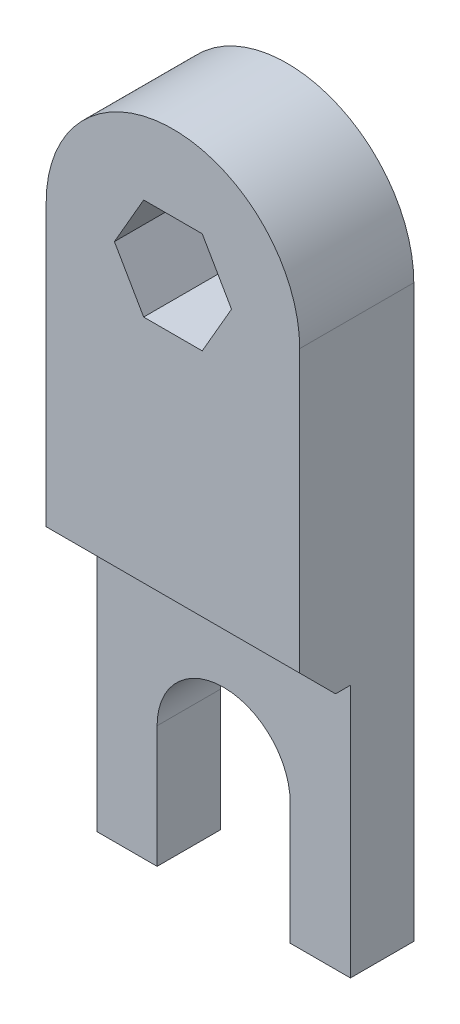
ISO-10303-21;
HEADER;
FILE_DESCRIPTION(('STEP AP214'),'2;1');
FILE_NAME('part.step','',(''),(''),'','','');
FILE_SCHEMA(('AUTOMOTIVE_DESIGN { 1 0 10303 214 1 1 1 1 }'));
ENDSEC;
DATA;
#1=APPLICATION_CONTEXT('core data for automotive mechanical design processes');
#2=APPLICATION_PROTOCOL_DEFINITION('international standard','automotive_design',2000,#1);
#3=PRODUCT_CONTEXT('',#1,'mechanical');
#4=PRODUCT('Part','Part','',(#3));
#5=PRODUCT_RELATED_PRODUCT_CATEGORY('part','',(#4));
#6=PRODUCT_DEFINITION_FORMATION('','',#4);
#7=PRODUCT_DEFINITION_CONTEXT('part definition',#1,'design');
#8=PRODUCT_DEFINITION('design','',#6,#7);
#9=PRODUCT_DEFINITION_SHAPE('','',#8);
#10=(LENGTH_UNIT() NAMED_UNIT(*) SI_UNIT(.MILLI.,.METRE.));
#11=(NAMED_UNIT(*) PLANE_ANGLE_UNIT() SI_UNIT($,.RADIAN.));
#12=(NAMED_UNIT(*) SI_UNIT($,.STERADIAN.) SOLID_ANGLE_UNIT());
#13=UNCERTAINTY_MEASURE_WITH_UNIT(LENGTH_MEASURE(1.E-05),#10,'distance_accuracy_value','');
#14=(GEOMETRIC_REPRESENTATION_CONTEXT(3) GLOBAL_UNCERTAINTY_ASSIGNED_CONTEXT((#13)) GLOBAL_UNIT_ASSIGNED_CONTEXT((#10,
#11,#12)) REPRESENTATION_CONTEXT('',''));
#15=CARTESIAN_POINT('',(0.,0.,0.));
#16=DIRECTION('',(0.,0.,1.));
#17=DIRECTION('',(1.,0.,0.));
#18=AXIS2_PLACEMENT_3D('',#15,#16,#17);
#19=CARTESIAN_POINT('',(4.,4.000000018127,3.6));
#20=DIRECTION('',(0.,-1.,0.));
#21=DIRECTION('',(0.,0.,-1.));
#22=AXIS2_PLACEMENT_3D('',#19,#20,#21);
#23=PLANE('',#22);
#24=DIRECTION('',(0.,0.,-1.));
#25=VECTOR('',#24,1.);
#26=CARTESIAN_POINT('',(-4.00000000000001,4.000000018127,3.6));
#27=LINE('',#26,#25);
#28=CARTESIAN_POINT('',(-4.00000000000001,4.000000018127,2.4686289387967));
#29=VERTEX_POINT('',#28);
#30=CARTESIAN_POINT('',(-3.99999999999984,4.000000018127,2.));
#31=VERTEX_POINT('',#30);
#32=EDGE_CURVE('E295',#29,#31,#27,.T.);
#33=ORIENTED_EDGE('',*,*,#32,.T.);
#34=DIRECTION('',(1.,0.,0.));
#35=VECTOR('',#34,1.);
#36=CARTESIAN_POINT('',(-3.99999999999984,4.000000018127,2.));
#37=LINE('',#36,#35);
#38=CARTESIAN_POINT('',(4.,4.000000018127,2.));
#39=VERTEX_POINT('',#38);
#40=EDGE_CURVE('E169',#31,#39,#37,.T.);
#41=ORIENTED_EDGE('',*,*,#40,.T.);
#42=DIRECTION('',(0.,0.,-1.));
#43=VECTOR('',#42,1.);
#44=CARTESIAN_POINT('',(4.,4.000000018127,3.6));
#45=LINE('',#44,#43);
#46=CARTESIAN_POINT('',(4.,4.000000018127,2.4686289387967));
#47=VERTEX_POINT('',#46);
#48=EDGE_CURVE('E180',#47,#39,#45,.T.);
#49=ORIENTED_EDGE('',*,*,#48,.F.);
#50=DIRECTION('',(-1.,0.,0.));
#51=VECTOR('',#50,1.);
#52=CARTESIAN_POINT('',(-4.00000000000001,4.000000018127,2.4686289387967));
#53=LINE('',#52,#51);
#54=EDGE_CURVE('E294',#47,#29,#53,.T.);
#55=ORIENTED_EDGE('',*,*,#54,.T.);
#56=EDGE_LOOP('',(#33,#41,#49,#55));
#57=FACE_BOUND('',#56,.T.);
#58=ADVANCED_FACE('F37',(#57),#23,.T.);
#59=CARTESIAN_POINT('',(0.,14.,3.6));
#60=DIRECTION('',(0.,0.,-1.));
#61=DIRECTION('',(-1.,0.,0.));
#62=AXIS2_PLACEMENT_3D('',#59,#60,#61);
#63=CYLINDRICAL_SURFACE('',#62,4.00000000000001);
#64=CARTESIAN_POINT('',(0.,14.,0.));
#65=DIRECTION('',(0.,0.,-1.));
#66=DIRECTION('',(-1.,0.,0.));
#67=AXIS2_PLACEMENT_3D('',#64,#65,#66);
#68=CIRCLE('',#67,4.00000000000001);
#69=CARTESIAN_POINT('',(-4.00000000000002,14.,0.));
#70=VERTEX_POINT('',#69);
#71=CARTESIAN_POINT('',(4.,14.0000000000001,0.));
#72=VERTEX_POINT('',#71);
#73=EDGE_CURVE('E264',#70,#72,#68,.T.);
#74=ORIENTED_EDGE('',*,*,#73,.F.);
#75=DIRECTION('',(0.,0.,-1.));
#76=VECTOR('',#75,1.);
#77=CARTESIAN_POINT('',(-4.00000000000002,14.,3.6));
#78=LINE('',#77,#76);
#79=CARTESIAN_POINT('',(-4.00000000000002,14.,3.6));
#80=VERTEX_POINT('',#79);
#81=EDGE_CURVE('E292',#80,#70,#78,.T.);
#82=ORIENTED_EDGE('',*,*,#81,.F.);
#83=CARTESIAN_POINT('',(0.,14.,3.6));
#84=DIRECTION('',(0.,0.,-1.));
#85=DIRECTION('',(-1.,0.,0.));
#86=AXIS2_PLACEMENT_3D('',#83,#84,#85);
#87=CIRCLE('',#86,4.00000000000001);
#88=CARTESIAN_POINT('',(4.,14.0000000000001,3.6));
#89=VERTEX_POINT('',#88);
#90=EDGE_CURVE('E275',#80,#89,#87,.T.);
#91=ORIENTED_EDGE('',*,*,#90,.T.);
#92=DIRECTION('',(0.,0.,-1.));
#93=VECTOR('',#92,1.);
#94=CARTESIAN_POINT('',(4.,14.0000000000001,3.6));
#95=LINE('',#94,#93);
#96=EDGE_CURVE('E284',#89,#72,#95,.T.);
#97=ORIENTED_EDGE('',*,*,#96,.T.);
#98=EDGE_LOOP('',(#74,#82,#91,#97));
#99=FACE_BOUND('',#98,.T.);
#100=ADVANCED_FACE('F309',(#99),#63,.T.);
#101=CARTESIAN_POINT('',(-4.00000000000001,4.000000018127,3.6));
#102=DIRECTION('',(-1.,0.,0.));
#103=DIRECTION('',(0.,-1.,0.));
#104=AXIS2_PLACEMENT_3D('',#101,#102,#103);
#105=PLANE('',#104);
#106=ORIENTED_EDGE('',*,*,#32,.F.);
#107=DIRECTION('',(0.,0.707106690551039,0.707106871822044));
#108=VECTOR('',#107,1.);
#109=CARTESIAN_POINT('',(-4.00000000000001,4.56568554872863,3.03431461441518));
#110=LINE('',#109,#108);
#111=CARTESIAN_POINT('',(-4.00000000000001,5.13137078929667,3.6));
#112=VERTEX_POINT('',#111);
#113=EDGE_CURVE('E304',#29,#112,#110,.T.);
#114=ORIENTED_EDGE('',*,*,#113,.T.);
#115=DIRECTION('',(0.,1.,0.));
#116=VECTOR('',#115,1.);
#117=CARTESIAN_POINT('',(-4.00000000000001,4.000000018127,3.6));
#118=LINE('',#117,#116);
#119=EDGE_CURVE('E282',#112,#80,#118,.T.);
#120=ORIENTED_EDGE('',*,*,#119,.T.);
#121=ORIENTED_EDGE('',*,*,#81,.T.);
#122=DIRECTION('',(0.,1.,0.));
#123=VECTOR('',#122,1.);
#124=CARTESIAN_POINT('',(-4.00000000000001,4.000000018127,0.));
#125=LINE('',#124,#123);
#126=CARTESIAN_POINT('',(-3.99999999999984,-4.,0.));
#127=VERTEX_POINT('',#126);
#128=EDGE_CURVE('E279',#127,#70,#125,.T.);
#129=ORIENTED_EDGE('',*,*,#128,.F.);
#130=DIRECTION('',(0.,0.,-1.));
#131=VECTOR('',#130,1.);
#132=CARTESIAN_POINT('',(-3.99999999999984,-4.,2.));
#133=LINE('',#132,#131);
#134=CARTESIAN_POINT('',(-3.99999999999984,-4.,2.));
#135=VERTEX_POINT('',#134);
#136=EDGE_CURVE('E217',#135,#127,#133,.T.);
#137=ORIENTED_EDGE('',*,*,#136,.F.);
#138=DIRECTION('',(0.,1.,0.));
#139=VECTOR('',#138,1.);
#140=CARTESIAN_POINT('',(-3.99999999999984,-4.,2.));
#141=LINE('',#140,#139);
#142=EDGE_CURVE('E191',#135,#31,#141,.T.);
#143=ORIENTED_EDGE('',*,*,#142,.T.);
#144=EDGE_LOOP('',(#106,#114,#120,#121,#129,#137,#143));
#145=FACE_BOUND('',#144,.T.);
#146=ADVANCED_FACE('F315',(#145),#105,.T.);
#147=CARTESIAN_POINT('',(4.,14.0000000000001,3.6));
#148=DIRECTION('',(1.,0.,0.));
#149=DIRECTION('',(0.,1.,0.));
#150=AXIS2_PLACEMENT_3D('',#147,#148,#149);
#151=PLANE('',#150);
#152=DIRECTION('',(0.,-1.,0.));
#153=VECTOR('',#152,1.);
#154=CARTESIAN_POINT('',(4.,14.0000000000001,3.6));
#155=LINE('',#154,#153);
#156=CARTESIAN_POINT('',(4.,5.13137078929668,3.6));
#157=VERTEX_POINT('',#156);
#158=EDGE_CURVE('E278',#89,#157,#155,.T.);
#159=ORIENTED_EDGE('',*,*,#158,.T.);
#160=DIRECTION('',(0.,-0.707106690551039,-0.707106871822044));
#161=VECTOR('',#160,1.);
#162=CARTESIAN_POINT('',(4.,9.56568425788561,8.03431460535156));
#163=LINE('',#162,#161);
#164=EDGE_CURVE('E11',#157,#47,#163,.T.);
#165=ORIENTED_EDGE('',*,*,#164,.T.);
#166=ORIENTED_EDGE('',*,*,#48,.T.);
#167=DIRECTION('',(0.,-1.,0.));
#168=VECTOR('',#167,1.);
#169=CARTESIAN_POINT('',(4.,4.000000018127,2.));
#170=LINE('',#169,#168);
#171=CARTESIAN_POINT('',(4.,-4.,2.));
#172=VERTEX_POINT('',#171);
#173=EDGE_CURVE('E54',#39,#172,#170,.T.);
#174=ORIENTED_EDGE('',*,*,#173,.T.);
#175=DIRECTION('',(0.,0.,-1.));
#176=VECTOR('',#175,1.);
#177=CARTESIAN_POINT('',(4.,-4.,2.));
#178=LINE('',#177,#176);
#179=CARTESIAN_POINT('',(4.,-4.,0.));
#180=VERTEX_POINT('',#179);
#181=EDGE_CURVE('E161',#172,#180,#178,.T.);
#182=ORIENTED_EDGE('',*,*,#181,.T.);
#183=DIRECTION('',(0.,-1.,0.));
#184=VECTOR('',#183,1.);
#185=CARTESIAN_POINT('',(4.,14.0000000000001,0.));
#186=LINE('',#185,#184);
#187=EDGE_CURVE('E287',#72,#180,#186,.T.);
#188=ORIENTED_EDGE('',*,*,#187,.F.);
#189=ORIENTED_EDGE('',*,*,#96,.F.);
#190=EDGE_LOOP('',(#159,#165,#166,#174,#182,#188,#189));
#191=FACE_BOUND('',#190,.T.);
#192=ADVANCED_FACE('F178',(#191),#151,.T.);
#193=CARTESIAN_POINT('',(0.,14.,3.6));
#194=DIRECTION('',(0.,0.,-1.));
#195=DIRECTION('',(-1.,0.,0.));
#196=AXIS2_PLACEMENT_3D('',#193,#194,#195);
#197=PLANE('',#196);
#198=DIRECTION('',(-0.500000000000075,-0.866025403784395,0.));
#199=VECTOR('',#198,1.);
#200=CARTESIAN_POINT('',(0.92376,12.400000746,3.6));
#201=LINE('',#200,#199);
#202=CARTESIAN_POINT('',(1.84752000000021,13.9999999999999,3.6));
#203=VERTEX_POINT('',#202);
#204=CARTESIAN_POINT('',(0.92376,12.400000746,3.6));
#205=VERTEX_POINT('',#204);
#206=EDGE_CURVE('E243',#203,#205,#201,.T.);
#207=ORIENTED_EDGE('',*,*,#206,.T.);
#208=DIRECTION('',(-1.,0.,0.));
#209=VECTOR('',#208,1.);
#210=CARTESIAN_POINT('',(-0.923759999999616,12.4000007459999,3.6));
#211=LINE('',#210,#209);
#212=CARTESIAN_POINT('',(-0.923759999999616,12.4000007459999,3.6));
#213=VERTEX_POINT('',#212);
#214=EDGE_CURVE('E227',#205,#213,#211,.T.);
#215=ORIENTED_EDGE('',*,*,#214,.T.);
#216=DIRECTION('',(-0.500000000000015,0.86602540378443,0.));
#217=VECTOR('',#216,1.);
#218=CARTESIAN_POINT('',(-1.84751999999983,14.0000000000001,3.6));
#219=LINE('',#218,#217);
#220=CARTESIAN_POINT('',(-1.84751999999983,14.0000000000001,3.6));
#221=VERTEX_POINT('',#220);
#222=EDGE_CURVE('E230',#213,#221,#219,.T.);
#223=ORIENTED_EDGE('',*,*,#222,.T.);
#224=DIRECTION('',(0.5,0.866025403784439,0.));
#225=VECTOR('',#224,1.);
#226=CARTESIAN_POINT('',(-0.923759999999756,15.599999254,3.6));
#227=LINE('',#226,#225);
#228=CARTESIAN_POINT('',(-0.923759999999756,15.599999254,3.6));
#229=VERTEX_POINT('',#228);
#230=EDGE_CURVE('E234',#221,#229,#227,.T.);
#231=ORIENTED_EDGE('',*,*,#230,.T.);
#232=DIRECTION('',(1.,0.,0.));
#233=VECTOR('',#232,1.);
#234=CARTESIAN_POINT('',(0.923760000000031,15.599999254,3.6));
#235=LINE('',#234,#233);
#236=CARTESIAN_POINT('',(0.923760000000031,15.599999254,3.6));
#237=VERTEX_POINT('',#236);
#238=EDGE_CURVE('E237',#229,#237,#235,.T.);
#239=ORIENTED_EDGE('',*,*,#238,.T.);
#240=DIRECTION('',(0.5,-0.866025403784439,0.));
#241=VECTOR('',#240,1.);
#242=CARTESIAN_POINT('',(1.84752000000021,13.9999999999999,3.6));
#243=LINE('',#242,#241);
#244=EDGE_CURVE('E240',#237,#203,#243,.T.);
#245=ORIENTED_EDGE('',*,*,#244,.T.);
#246=EDGE_LOOP('',(#207,#215,#223,#231,#239,#245));
#247=FACE_BOUND('',#246,.T.);
#248=ORIENTED_EDGE('',*,*,#119,.F.);
#249=DIRECTION('',(1.,0.,0.));
#250=VECTOR('',#249,1.);
#251=CARTESIAN_POINT('',(4.,5.13137078929667,3.6));
#252=LINE('',#251,#250);
#253=EDGE_CURVE('E46',#112,#157,#252,.T.);
#254=ORIENTED_EDGE('',*,*,#253,.T.);
#255=ORIENTED_EDGE('',*,*,#158,.F.);
#256=ORIENTED_EDGE('',*,*,#90,.F.);
#257=EDGE_LOOP('',(#248,#254,#255,#256));
#258=FACE_BOUND('',#257,.T.);
#259=ADVANCED_FACE('F347',(#247,#258),#197,.F.);
#260=CARTESIAN_POINT('',(0.,14.,0.));
#261=DIRECTION('',(0.,0.,-1.));
#262=DIRECTION('',(-1.,0.,0.));
#263=AXIS2_PLACEMENT_3D('',#260,#261,#262);
#264=PLANE('',#263);
#265=DIRECTION('',(-1.,0.,0.));
#266=VECTOR('',#265,1.);
#267=CARTESIAN_POINT('',(-0.923759999999616,12.4000007459999,0.));
#268=LINE('',#267,#266);
#269=CARTESIAN_POINT('',(0.92376,12.400000746,0.));
#270=VERTEX_POINT('',#269);
#271=CARTESIAN_POINT('',(-0.923759999999616,12.4000007459999,0.));
#272=VERTEX_POINT('',#271);
#273=EDGE_CURVE('E219',#270,#272,#268,.T.);
#274=ORIENTED_EDGE('',*,*,#273,.F.);
#275=DIRECTION('',(-0.500000000000075,-0.866025403784395,0.));
#276=VECTOR('',#275,1.);
#277=CARTESIAN_POINT('',(0.92376,12.400000746,0.));
#278=LINE('',#277,#276);
#279=CARTESIAN_POINT('',(1.84752000000021,13.9999999999999,0.));
#280=VERTEX_POINT('',#279);
#281=EDGE_CURVE('E231',#280,#270,#278,.T.);
#282=ORIENTED_EDGE('',*,*,#281,.F.);
#283=DIRECTION('',(0.5,-0.866025403784439,0.));
#284=VECTOR('',#283,1.);
#285=CARTESIAN_POINT('',(1.84752000000021,13.9999999999999,0.));
#286=LINE('',#285,#284);
#287=CARTESIAN_POINT('',(0.923760000000031,15.599999254,0.));
#288=VERTEX_POINT('',#287);
#289=EDGE_CURVE('E257',#288,#280,#286,.T.);
#290=ORIENTED_EDGE('',*,*,#289,.F.);
#291=DIRECTION('',(1.,0.,0.));
#292=VECTOR('',#291,1.);
#293=CARTESIAN_POINT('',(0.923760000000031,15.599999254,0.));
#294=LINE('',#293,#292);
#295=CARTESIAN_POINT('',(-0.923759999999756,15.599999254,0.));
#296=VERTEX_POINT('',#295);
#297=EDGE_CURVE('E254',#296,#288,#294,.T.);
#298=ORIENTED_EDGE('',*,*,#297,.F.);
#299=DIRECTION('',(0.5,0.866025403784439,0.));
#300=VECTOR('',#299,1.);
#301=CARTESIAN_POINT('',(-0.923759999999756,15.599999254,0.));
#302=LINE('',#301,#300);
#303=CARTESIAN_POINT('',(-1.84751999999983,14.0000000000001,0.));
#304=VERTEX_POINT('',#303);
#305=EDGE_CURVE('E251',#304,#296,#302,.T.);
#306=ORIENTED_EDGE('',*,*,#305,.F.);
#307=DIRECTION('',(-0.500000000000015,0.86602540378443,0.));
#308=VECTOR('',#307,1.);
#309=CARTESIAN_POINT('',(-1.84751999999983,14.0000000000001,0.));
#310=LINE('',#309,#308);
#311=EDGE_CURVE('E248',#272,#304,#310,.T.);
#312=ORIENTED_EDGE('',*,*,#311,.F.);
#313=EDGE_LOOP('',(#274,#282,#290,#298,#306,#312));
#314=FACE_BOUND('',#313,.T.);
#315=ORIENTED_EDGE('',*,*,#73,.T.);
#316=ORIENTED_EDGE('',*,*,#187,.T.);
#317=DIRECTION('',(-1.,0.,0.));
#318=VECTOR('',#317,1.);
#319=CARTESIAN_POINT('',(4.,-4.,0.));
#320=LINE('',#319,#318);
#321=CARTESIAN_POINT('',(2.1,-4.,0.));
#322=VERTEX_POINT('',#321);
#323=EDGE_CURVE('E165',#180,#322,#320,.T.);
#324=ORIENTED_EDGE('',*,*,#323,.T.);
#325=DIRECTION('',(0.,1.,0.));
#326=VECTOR('',#325,1.);
#327=CARTESIAN_POINT('',(2.1,-4.,0.));
#328=LINE('',#327,#326);
#329=CARTESIAN_POINT('',(2.09999999999993,-0.156392754570969,0.));
#330=VERTEX_POINT('',#329);
#331=EDGE_CURVE('E209',#322,#330,#328,.T.);
#332=ORIENTED_EDGE('',*,*,#331,.T.);
#333=CARTESIAN_POINT('',(0.,-0.156392754570966,0.));
#334=DIRECTION('',(0.,0.,1.));
#335=DIRECTION('',(-1.,0.,0.));
#336=AXIS2_PLACEMENT_3D('',#333,#334,#335);
#337=CIRCLE('',#336,2.09999999999992);
#338=CARTESIAN_POINT('',(-2.09999999999992,-0.156392754570964,0.));
#339=VERTEX_POINT('',#338);
#340=EDGE_CURVE('E212',#330,#339,#337,.T.);
#341=ORIENTED_EDGE('',*,*,#340,.T.);
#342=DIRECTION('',(0.,-1.,0.));
#343=VECTOR('',#342,1.);
#344=CARTESIAN_POINT('',(-2.09999999999992,-0.156392754570964,0.));
#345=LINE('',#344,#343);
#346=CARTESIAN_POINT('',(-2.09999999999984,-4.,0.));
#347=VERTEX_POINT('',#346);
#348=EDGE_CURVE('E184',#339,#347,#345,.T.);
#349=ORIENTED_EDGE('',*,*,#348,.T.);
#350=DIRECTION('',(-1.,0.,0.));
#351=VECTOR('',#350,1.);
#352=CARTESIAN_POINT('',(-2.09999999999984,-4.,0.));
#353=LINE('',#352,#351);
#354=EDGE_CURVE('E181',#347,#127,#353,.T.);
#355=ORIENTED_EDGE('',*,*,#354,.T.);
#356=ORIENTED_EDGE('',*,*,#128,.T.);
#357=EDGE_LOOP('',(#315,#316,#324,#332,#341,#349,#355,#356));
#358=FACE_BOUND('',#357,.T.);
#359=ADVANCED_FACE('F313',(#314,#358),#264,.T.);
#360=CARTESIAN_POINT('',(-0.923759999999616,12.4000007459999,3.6));
#361=DIRECTION('',(0.,-1.,0.));
#362=DIRECTION('',(1.,0.,0.));
#363=AXIS2_PLACEMENT_3D('',#360,#361,#362);
#364=PLANE('',#363);
#365=ORIENTED_EDGE('',*,*,#273,.T.);
#366=DIRECTION('',(0.,0.,-1.));
#367=VECTOR('',#366,1.);
#368=CARTESIAN_POINT('',(-0.923759999999616,12.4000007459999,3.6));
#369=LINE('',#368,#367);
#370=EDGE_CURVE('E246',#213,#272,#369,.T.);
#371=ORIENTED_EDGE('',*,*,#370,.F.);
#372=ORIENTED_EDGE('',*,*,#214,.F.);
#373=DIRECTION('',(0.,0.,-1.));
#374=VECTOR('',#373,1.);
#375=CARTESIAN_POINT('',(0.92376,12.400000746,3.6));
#376=LINE('',#375,#374);
#377=EDGE_CURVE('E262',#205,#270,#376,.T.);
#378=ORIENTED_EDGE('',*,*,#377,.T.);
#379=EDGE_LOOP('',(#365,#371,#372,#378));
#380=FACE_BOUND('',#379,.T.);
#381=ADVANCED_FACE('F366',(#380),#364,.F.);
#382=CARTESIAN_POINT('',(0.92376,12.400000746,3.6));
#383=DIRECTION('',(0.866025403784395,-0.500000000000075,0.));
#384=DIRECTION('',(0.500000000000075,0.866025403784395,0.));
#385=AXIS2_PLACEMENT_3D('',#382,#383,#384);
#386=PLANE('',#385);
#387=ORIENTED_EDGE('',*,*,#281,.T.);
#388=ORIENTED_EDGE('',*,*,#377,.F.);
#389=ORIENTED_EDGE('',*,*,#206,.F.);
#390=DIRECTION('',(0.,0.,-1.));
#391=VECTOR('',#390,1.);
#392=CARTESIAN_POINT('',(1.84752000000021,13.9999999999999,3.6));
#393=LINE('',#392,#391);
#394=EDGE_CURVE('E265',#203,#280,#393,.T.);
#395=ORIENTED_EDGE('',*,*,#394,.T.);
#396=EDGE_LOOP('',(#387,#388,#389,#395));
#397=FACE_BOUND('',#396,.T.);
#398=ADVANCED_FACE('F371',(#397),#386,.F.);
#399=CARTESIAN_POINT('',(1.84752000000021,13.9999999999999,3.6));
#400=DIRECTION('',(0.866025403784438,0.5,0.));
#401=DIRECTION('',(-0.5,0.866025403784439,0.));
#402=AXIS2_PLACEMENT_3D('',#399,#400,#401);
#403=PLANE('',#402);
#404=ORIENTED_EDGE('',*,*,#289,.T.);
#405=ORIENTED_EDGE('',*,*,#394,.F.);
#406=ORIENTED_EDGE('',*,*,#244,.F.);
#407=DIRECTION('',(0.,0.,-1.));
#408=VECTOR('',#407,1.);
#409=CARTESIAN_POINT('',(0.923760000000031,15.599999254,3.6));
#410=LINE('',#409,#408);
#411=EDGE_CURVE('E267',#237,#288,#410,.T.);
#412=ORIENTED_EDGE('',*,*,#411,.T.);
#413=EDGE_LOOP('',(#404,#405,#406,#412));
#414=FACE_BOUND('',#413,.T.);
#415=ADVANCED_FACE('F383',(#414),#403,.F.);
#416=CARTESIAN_POINT('',(0.923760000000031,15.599999254,3.6));
#417=DIRECTION('',(0.,1.,0.));
#418=DIRECTION('',(0.,0.,1.));
#419=AXIS2_PLACEMENT_3D('',#416,#417,#418);
#420=PLANE('',#419);
#421=ORIENTED_EDGE('',*,*,#297,.T.);
#422=ORIENTED_EDGE('',*,*,#411,.F.);
#423=ORIENTED_EDGE('',*,*,#238,.F.);
#424=DIRECTION('',(0.,0.,-1.));
#425=VECTOR('',#424,1.);
#426=CARTESIAN_POINT('',(-0.923759999999756,15.599999254,3.6));
#427=LINE('',#426,#425);
#428=EDGE_CURVE('E269',#229,#296,#427,.T.);
#429=ORIENTED_EDGE('',*,*,#428,.T.);
#430=EDGE_LOOP('',(#421,#422,#423,#429));
#431=FACE_BOUND('',#430,.T.);
#432=ADVANCED_FACE('F393',(#431),#420,.F.);
#433=CARTESIAN_POINT('',(-0.923759999999756,15.599999254,3.6));
#434=DIRECTION('',(-0.866025403784439,0.5,0.));
#435=DIRECTION('',(-0.5,-0.866025403784439,0.));
#436=AXIS2_PLACEMENT_3D('',#433,#434,#435);
#437=PLANE('',#436);
#438=ORIENTED_EDGE('',*,*,#305,.T.);
#439=ORIENTED_EDGE('',*,*,#428,.F.);
#440=ORIENTED_EDGE('',*,*,#230,.F.);
#441=DIRECTION('',(0.,0.,-1.));
#442=VECTOR('',#441,1.);
#443=CARTESIAN_POINT('',(-1.84751999999983,14.0000000000001,3.6));
#444=LINE('',#443,#442);
#445=EDGE_CURVE('E271',#221,#304,#444,.T.);
#446=ORIENTED_EDGE('',*,*,#445,.T.);
#447=EDGE_LOOP('',(#438,#439,#440,#446));
#448=FACE_BOUND('',#447,.T.);
#449=ADVANCED_FACE('F403',(#448),#437,.F.);
#450=CARTESIAN_POINT('',(-1.84751999999983,14.0000000000001,3.6));
#451=DIRECTION('',(-0.86602540378443,-0.500000000000015,0.));
#452=DIRECTION('',(0.500000000000015,-0.86602540378443,0.));
#453=AXIS2_PLACEMENT_3D('',#450,#451,#452);
#454=PLANE('',#453);
#455=ORIENTED_EDGE('',*,*,#311,.T.);
#456=ORIENTED_EDGE('',*,*,#445,.F.);
#457=ORIENTED_EDGE('',*,*,#222,.F.);
#458=ORIENTED_EDGE('',*,*,#370,.T.);
#459=EDGE_LOOP('',(#455,#456,#457,#458));
#460=FACE_BOUND('',#459,.T.);
#461=ADVANCED_FACE('F413',(#460),#454,.F.);
#462=CARTESIAN_POINT('',(4.,4.000000018127,2.4686289387967));
#463=DIRECTION('',(0.,-0.707106871822044,0.707106690551039));
#464=DIRECTION('',(1.,0.,0.));
#465=AXIS2_PLACEMENT_3D('',#462,#463,#464);
#466=PLANE('',#465);
#467=ORIENTED_EDGE('',*,*,#164,.F.);
#468=ORIENTED_EDGE('',*,*,#253,.F.);
#469=ORIENTED_EDGE('',*,*,#113,.F.);
#470=ORIENTED_EDGE('',*,*,#54,.F.);
#471=EDGE_LOOP('',(#467,#468,#469,#470));
#472=FACE_BOUND('',#471,.T.);
#473=ADVANCED_FACE('F39',(#472),#466,.T.);
#474=CARTESIAN_POINT('',(-2.09999999999984,-4.,2.));
#475=DIRECTION('',(0.,-1.,0.));
#476=DIRECTION('',(0.,0.,-1.));
#477=AXIS2_PLACEMENT_3D('',#474,#475,#476);
#478=PLANE('',#477);
#479=ORIENTED_EDGE('',*,*,#354,.F.);
#480=DIRECTION('',(0.,0.,-1.));
#481=VECTOR('',#480,1.);
#482=CARTESIAN_POINT('',(-2.09999999999984,-4.,2.));
#483=LINE('',#482,#481);
#484=CARTESIAN_POINT('',(-2.09999999999984,-4.,2.));
#485=VERTEX_POINT('',#484);
#486=EDGE_CURVE('E220',#485,#347,#483,.T.);
#487=ORIENTED_EDGE('',*,*,#486,.F.);
#488=DIRECTION('',(-1.,0.,0.));
#489=VECTOR('',#488,1.);
#490=CARTESIAN_POINT('',(-2.09999999999984,-4.,2.));
#491=LINE('',#490,#489);
#492=EDGE_CURVE('E192',#485,#135,#491,.T.);
#493=ORIENTED_EDGE('',*,*,#492,.T.);
#494=ORIENTED_EDGE('',*,*,#136,.T.);
#495=EDGE_LOOP('',(#479,#487,#493,#494));
#496=FACE_BOUND('',#495,.T.);
#497=ADVANCED_FACE('F316',(#496),#478,.T.);
#498=CARTESIAN_POINT('',(-2.09999999999992,-0.156392754570964,2.));
#499=DIRECTION('',(1.,0.,0.));
#500=DIRECTION('',(0.,1.,0.));
#501=AXIS2_PLACEMENT_3D('',#498,#499,#500);
#502=PLANE('',#501);
#503=ORIENTED_EDGE('',*,*,#348,.F.);
#504=DIRECTION('',(0.,0.,-1.));
#505=VECTOR('',#504,1.);
#506=CARTESIAN_POINT('',(-2.09999999999992,-0.156392754570964,2.));
#507=LINE('',#506,#505);
#508=CARTESIAN_POINT('',(-2.09999999999992,-0.156392754570964,2.));
#509=VERTEX_POINT('',#508);
#510=EDGE_CURVE('E222',#509,#339,#507,.T.);
#511=ORIENTED_EDGE('',*,*,#510,.F.);
#512=DIRECTION('',(0.,-1.,0.));
#513=VECTOR('',#512,1.);
#514=CARTESIAN_POINT('',(-2.09999999999992,-0.156392754570964,2.));
#515=LINE('',#514,#513);
#516=EDGE_CURVE('E197',#509,#485,#515,.T.);
#517=ORIENTED_EDGE('',*,*,#516,.T.);
#518=ORIENTED_EDGE('',*,*,#486,.T.);
#519=EDGE_LOOP('',(#503,#511,#517,#518));
#520=FACE_BOUND('',#519,.T.);
#521=ADVANCED_FACE('F320',(#520),#502,.T.);
#522=CARTESIAN_POINT('',(0.,-0.156392754570966,2.));
#523=DIRECTION('',(0.,0.,-1.));
#524=DIRECTION('',(-1.,0.,0.));
#525=AXIS2_PLACEMENT_3D('',#522,#523,#524);
#526=CYLINDRICAL_SURFACE('',#525,2.09999999999992);
#527=ORIENTED_EDGE('',*,*,#340,.F.);
#528=DIRECTION('',(0.,0.,-1.));
#529=VECTOR('',#528,1.);
#530=CARTESIAN_POINT('',(2.09999999999993,-0.156392754570969,2.));
#531=LINE('',#530,#529);
#532=CARTESIAN_POINT('',(2.09999999999993,-0.156392754570969,2.));
#533=VERTEX_POINT('',#532);
#534=EDGE_CURVE('E224',#533,#330,#531,.T.);
#535=ORIENTED_EDGE('',*,*,#534,.F.);
#536=CARTESIAN_POINT('',(0.,-0.156392754570966,2.));
#537=DIRECTION('',(0.,0.,1.));
#538=DIRECTION('',(-1.,0.,0.));
#539=AXIS2_PLACEMENT_3D('',#536,#537,#538);
#540=CIRCLE('',#539,2.09999999999992);
#541=EDGE_CURVE('E203',#533,#509,#540,.T.);
#542=ORIENTED_EDGE('',*,*,#541,.T.);
#543=ORIENTED_EDGE('',*,*,#510,.T.);
#544=EDGE_LOOP('',(#527,#535,#542,#543));
#545=FACE_BOUND('',#544,.T.);
#546=ADVANCED_FACE('F324',(#545),#526,.F.);
#547=CARTESIAN_POINT('',(2.1,-4.,2.));
#548=DIRECTION('',(-1.,0.,0.));
#549=DIRECTION('',(0.,-1.,0.));
#550=AXIS2_PLACEMENT_3D('',#547,#548,#549);
#551=PLANE('',#550);
#552=ORIENTED_EDGE('',*,*,#331,.F.);
#553=DIRECTION('',(0.,0.,-1.));
#554=VECTOR('',#553,1.);
#555=CARTESIAN_POINT('',(2.1,-4.,2.));
#556=LINE('',#555,#554);
#557=CARTESIAN_POINT('',(2.1,-4.,2.));
#558=VERTEX_POINT('',#557);
#559=EDGE_CURVE('E168',#558,#322,#556,.T.);
#560=ORIENTED_EDGE('',*,*,#559,.F.);
#561=DIRECTION('',(0.,1.,0.));
#562=VECTOR('',#561,1.);
#563=CARTESIAN_POINT('',(2.1,-4.,2.));
#564=LINE('',#563,#562);
#565=EDGE_CURVE('E175',#558,#533,#564,.T.);
#566=ORIENTED_EDGE('',*,*,#565,.T.);
#567=ORIENTED_EDGE('',*,*,#534,.T.);
#568=EDGE_LOOP('',(#552,#560,#566,#567));
#569=FACE_BOUND('',#568,.T.);
#570=ADVANCED_FACE('F328',(#569),#551,.T.);
#571=CARTESIAN_POINT('',(4.,-4.,2.));
#572=DIRECTION('',(0.,-1.,0.));
#573=DIRECTION('',(0.,0.,-1.));
#574=AXIS2_PLACEMENT_3D('',#571,#572,#573);
#575=PLANE('',#574);
#576=ORIENTED_EDGE('',*,*,#323,.F.);
#577=ORIENTED_EDGE('',*,*,#181,.F.);
#578=DIRECTION('',(-1.,0.,0.));
#579=VECTOR('',#578,1.);
#580=CARTESIAN_POINT('',(4.,-4.,2.));
#581=LINE('',#580,#579);
#582=EDGE_CURVE('E163',#172,#558,#581,.T.);
#583=ORIENTED_EDGE('',*,*,#582,.T.);
#584=ORIENTED_EDGE('',*,*,#559,.T.);
#585=EDGE_LOOP('',(#576,#577,#583,#584));
#586=FACE_BOUND('',#585,.T.);
#587=ADVANCED_FACE('F162',(#586),#575,.T.);
#588=CARTESIAN_POINT('',(0.,-0.156392754570966,2.));
#589=DIRECTION('',(0.,0.,-1.));
#590=DIRECTION('',(-1.,0.,0.));
#591=AXIS2_PLACEMENT_3D('',#588,#589,#590);
#592=PLANE('',#591);
#593=ORIENTED_EDGE('',*,*,#173,.F.);
#594=ORIENTED_EDGE('',*,*,#40,.F.);
#595=ORIENTED_EDGE('',*,*,#142,.F.);
#596=ORIENTED_EDGE('',*,*,#492,.F.);
#597=ORIENTED_EDGE('',*,*,#516,.F.);
#598=ORIENTED_EDGE('',*,*,#541,.F.);
#599=ORIENTED_EDGE('',*,*,#565,.F.);
#600=ORIENTED_EDGE('',*,*,#582,.F.);
#601=EDGE_LOOP('',(#593,#594,#595,#596,#597,#598,#599,#600));
#602=FACE_BOUND('',#601,.T.);
#603=ADVANCED_FACE('F172',(#602),#592,.F.);
#604=CLOSED_SHELL('',(#58,#100,#146,#192,#259,#359,#381,#398,#415,#432,#449,#461,#473,#497,#521,
#546,#570,#587,#603));
#605=MANIFOLD_SOLID_BREP('B2',#604);
#606=ADVANCED_BREP_SHAPE_REPRESENTATION('',(#18,#605),#14);
#607=SHAPE_DEFINITION_REPRESENTATION(#9,#606);
ENDSEC;
END-ISO-10303-21;
